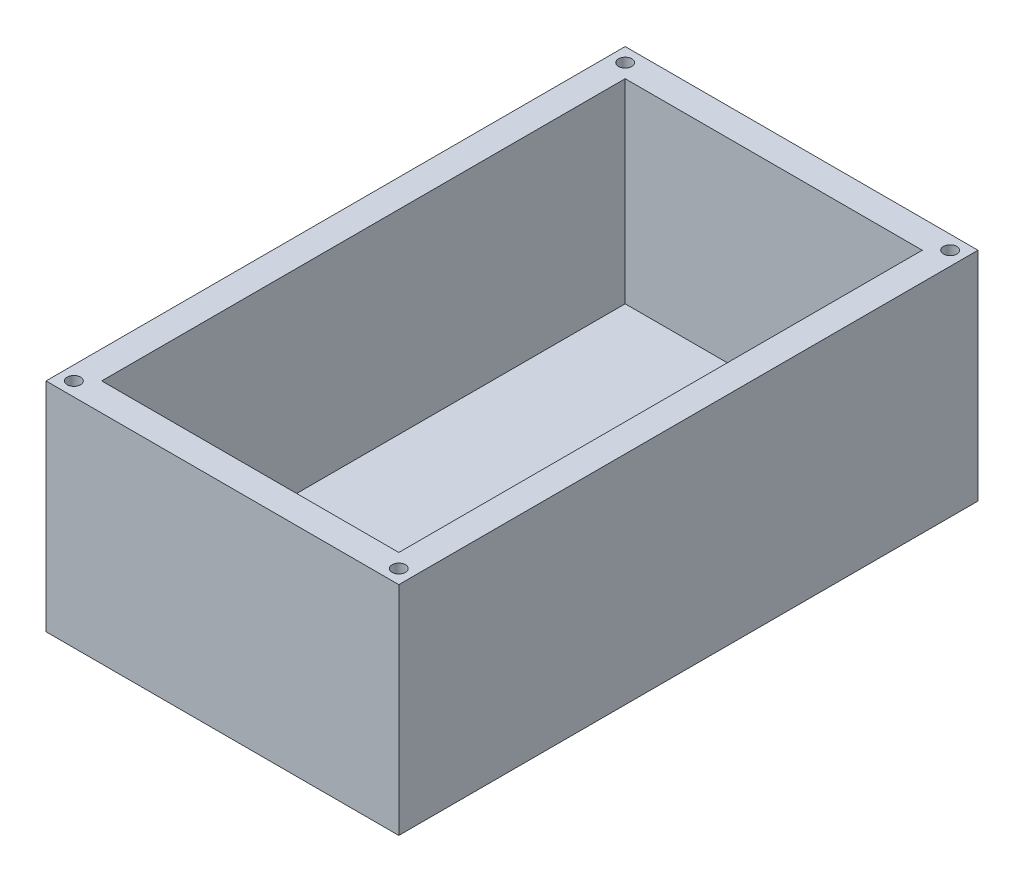
ISO-10303-21;
HEADER;
FILE_DESCRIPTION(('STEP AP214'),'2;1');
FILE_NAME('part.step','',(''),(''),'','','');
FILE_SCHEMA(('AUTOMOTIVE_DESIGN { 1 0 10303 214 1 1 1 1 }'));
ENDSEC;
DATA;
#1=APPLICATION_CONTEXT('core data for automotive mechanical design processes');
#2=APPLICATION_PROTOCOL_DEFINITION('international standard','automotive_design',2000,#1);
#3=PRODUCT_CONTEXT('',#1,'mechanical');
#4=PRODUCT('Part','Part','',(#3));
#5=PRODUCT_RELATED_PRODUCT_CATEGORY('part','',(#4));
#6=PRODUCT_DEFINITION_FORMATION('','',#4);
#7=PRODUCT_DEFINITION_CONTEXT('part definition',#1,'design');
#8=PRODUCT_DEFINITION('design','',#6,#7);
#9=PRODUCT_DEFINITION_SHAPE('','',#8);
#10=(LENGTH_UNIT() NAMED_UNIT(*) SI_UNIT(.MILLI.,.METRE.));
#11=(NAMED_UNIT(*) PLANE_ANGLE_UNIT() SI_UNIT($,.RADIAN.));
#12=(NAMED_UNIT(*) SI_UNIT($,.STERADIAN.) SOLID_ANGLE_UNIT());
#13=UNCERTAINTY_MEASURE_WITH_UNIT(LENGTH_MEASURE(1.E-05),#10,'distance_accuracy_value','');
#14=(GEOMETRIC_REPRESENTATION_CONTEXT(3) GLOBAL_UNCERTAINTY_ASSIGNED_CONTEXT((#13)) GLOBAL_UNIT_ASSIGNED_CONTEXT((#10,
#11,#12)) REPRESENTATION_CONTEXT('',''));
#15=CARTESIAN_POINT('',(0.,0.,0.));
#16=DIRECTION('',(0.,0.,1.));
#17=DIRECTION('',(1.,0.,0.));
#18=AXIS2_PLACEMENT_3D('',#15,#16,#17);
#19=CARTESIAN_POINT('',(2.49053892215568,4.,-3.42449101796407));
#20=DIRECTION('',(1.,0.,0.));
#21=DIRECTION('',(0.,0.,-1.));
#22=AXIS2_PLACEMENT_3D('',#19,#20,#21);
#23=PLANE('',#22);
#24=DIRECTION('',(0.,0.,1.));
#25=VECTOR('',#24,1.);
#26=CARTESIAN_POINT('',(2.49053892215568,0.,-3.42449101796407));
#27=LINE('',#26,#25);
#28=CARTESIAN_POINT('',(2.49053892215568,0.,-107.404491017964));
#29=VERTEX_POINT('',#28);
#30=CARTESIAN_POINT('',(2.49053892215568,0.,-3.42449101796407));
#31=VERTEX_POINT('',#30);
#32=EDGE_CURVE('E156',#29,#31,#27,.T.);
#33=ORIENTED_EDGE('',*,*,#32,.T.);
#34=DIRECTION('',(0.,-1.,0.));
#35=VECTOR('',#34,1.);
#36=CARTESIAN_POINT('',(2.49053892215568,4.,-3.42449101796407));
#37=LINE('',#36,#35);
#38=CARTESIAN_POINT('',(2.49053892215568,39.,-3.42449101796407));
#39=VERTEX_POINT('',#38);
#40=EDGE_CURVE('E11',#39,#31,#37,.T.);
#41=ORIENTED_EDGE('',*,*,#40,.F.);
#42=DIRECTION('',(0.,0.,1.));
#43=VECTOR('',#42,1.);
#44=CARTESIAN_POINT('',(2.49053892215568,39.,-107.404491017964));
#45=LINE('',#44,#43);
#46=CARTESIAN_POINT('',(2.49053892215568,39.,-107.404491017964));
#47=VERTEX_POINT('',#46);
#48=EDGE_CURVE('E119',#47,#39,#45,.T.);
#49=ORIENTED_EDGE('',*,*,#48,.F.);
#50=DIRECTION('',(0.,-1.,0.));
#51=VECTOR('',#50,1.);
#52=CARTESIAN_POINT('',(2.49053892215568,4.,-107.404491017964));
#53=LINE('',#52,#51);
#54=EDGE_CURVE('E164',#47,#29,#53,.T.);
#55=ORIENTED_EDGE('',*,*,#54,.T.);
#56=EDGE_LOOP('',(#33,#41,#49,#55));
#57=FACE_BOUND('',#56,.T.);
#58=ADVANCED_FACE('F37',(#57),#23,.F.);
#59=CARTESIAN_POINT('',(2.49053892215568,4.,-3.42449101796407));
#60=DIRECTION('',(0.,0.,-1.));
#61=DIRECTION('',(-1.,0.,0.));
#62=AXIS2_PLACEMENT_3D('',#59,#60,#61);
#63=PLANE('',#62);
#64=DIRECTION('',(1.,0.,0.));
#65=VECTOR('',#64,1.);
#66=CARTESIAN_POINT('',(2.49053892215568,0.,-3.42449101796407));
#67=LINE('',#66,#65);
#68=CARTESIAN_POINT('',(65.8305389221557,0.,-3.42449101796407));
#69=VERTEX_POINT('',#68);
#70=EDGE_CURVE('E159',#31,#69,#67,.T.);
#71=ORIENTED_EDGE('',*,*,#70,.T.);
#72=DIRECTION('',(0.,-1.,0.));
#73=VECTOR('',#72,1.);
#74=CARTESIAN_POINT('',(65.8305389221557,4.,-3.42449101796407));
#75=LINE('',#74,#73);
#76=CARTESIAN_POINT('',(65.8305389221557,39.,-3.42449101796407));
#77=VERTEX_POINT('',#76);
#78=EDGE_CURVE('E44',#77,#69,#75,.T.);
#79=ORIENTED_EDGE('',*,*,#78,.F.);
#80=DIRECTION('',(1.,0.,0.));
#81=VECTOR('',#80,1.);
#82=CARTESIAN_POINT('',(2.49053892215568,39.,-3.42449101796407));
#83=LINE('',#82,#81);
#84=EDGE_CURVE('E147',#39,#77,#83,.T.);
#85=ORIENTED_EDGE('',*,*,#84,.F.);
#86=ORIENTED_EDGE('',*,*,#40,.T.);
#87=EDGE_LOOP('',(#71,#79,#85,#86));
#88=FACE_BOUND('',#87,.T.);
#89=ADVANCED_FACE('F182',(#88),#63,.F.);
#90=CARTESIAN_POINT('',(65.8305389221557,4.,-3.42449101796407));
#91=DIRECTION('',(-1.,0.,0.));
#92=DIRECTION('',(0.,0.,1.));
#93=AXIS2_PLACEMENT_3D('',#90,#91,#92);
#94=PLANE('',#93);
#95=DIRECTION('',(0.,0.,-1.));
#96=VECTOR('',#95,1.);
#97=CARTESIAN_POINT('',(65.8305389221557,0.,-3.42449101796407));
#98=LINE('',#97,#96);
#99=CARTESIAN_POINT('',(65.8305389221557,0.,-107.404491017964));
#100=VERTEX_POINT('',#99);
#101=EDGE_CURVE('E161',#69,#100,#98,.T.);
#102=ORIENTED_EDGE('',*,*,#101,.T.);
#103=DIRECTION('',(0.,-1.,0.));
#104=VECTOR('',#103,1.);
#105=CARTESIAN_POINT('',(65.8305389221557,4.,-107.404491017964));
#106=LINE('',#105,#104);
#107=CARTESIAN_POINT('',(65.8305389221557,39.,-107.404491017964));
#108=VERTEX_POINT('',#107);
#109=EDGE_CURVE('E166',#108,#100,#106,.T.);
#110=ORIENTED_EDGE('',*,*,#109,.F.);
#111=DIRECTION('',(0.,0.,-1.));
#112=VECTOR('',#111,1.);
#113=CARTESIAN_POINT('',(65.8305389221557,39.,-107.404491017964));
#114=LINE('',#113,#112);
#115=EDGE_CURVE('E150',#77,#108,#114,.T.);
#116=ORIENTED_EDGE('',*,*,#115,.F.);
#117=ORIENTED_EDGE('',*,*,#78,.T.);
#118=EDGE_LOOP('',(#102,#110,#116,#117));
#119=FACE_BOUND('',#118,.T.);
#120=ADVANCED_FACE('F171',(#119),#94,.F.);
#121=CARTESIAN_POINT('',(2.49053892215568,4.,-107.404491017964));
#122=DIRECTION('',(0.,0.,1.));
#123=DIRECTION('',(1.,0.,0.));
#124=AXIS2_PLACEMENT_3D('',#121,#122,#123);
#125=PLANE('',#124);
#126=DIRECTION('',(-1.,0.,0.));
#127=VECTOR('',#126,1.);
#128=CARTESIAN_POINT('',(2.49053892215568,0.,-107.404491017964));
#129=LINE('',#128,#127);
#130=EDGE_CURVE('E59',#100,#29,#129,.T.);
#131=ORIENTED_EDGE('',*,*,#130,.T.);
#132=ORIENTED_EDGE('',*,*,#54,.F.);
#133=DIRECTION('',(-1.,0.,0.));
#134=VECTOR('',#133,1.);
#135=CARTESIAN_POINT('',(2.49053892215568,39.,-107.404491017964));
#136=LINE('',#135,#134);
#137=EDGE_CURVE('E153',#108,#47,#136,.T.);
#138=ORIENTED_EDGE('',*,*,#137,.F.);
#139=ORIENTED_EDGE('',*,*,#109,.T.);
#140=EDGE_LOOP('',(#131,#132,#138,#139));
#141=FACE_BOUND('',#140,.T.);
#142=ADVANCED_FACE('F180',(#141),#125,.F.);
#143=CARTESIAN_POINT('',(0.,0.,0.));
#144=DIRECTION('',(0.,-1.,0.));
#145=DIRECTION('',(0.,0.,-1.));
#146=AXIS2_PLACEMENT_3D('',#143,#144,#145);
#147=PLANE('',#146);
#148=CARTESIAN_POINT('',(4.99053892215568,0.,-104.904491017964));
#149=DIRECTION('',(0.,1.,0.));
#150=DIRECTION('',(0.,0.,1.));
#151=AXIS2_PLACEMENT_3D('',#148,#149,#150);
#152=CIRCLE('',#151,1.19999999999999);
#153=CARTESIAN_POINT('',(4.99053892215568,0.,-103.704491017964));
#154=VERTEX_POINT('',#153);
#155=EDGE_CURVE('E233',#154,#154,#152,.T.);
#156=ORIENTED_EDGE('',*,*,#155,.T.);
#157=EDGE_LOOP('',(#156));
#158=FACE_BOUND('',#157,.T.);
#159=CARTESIAN_POINT('',(63.3305389221557,0.,-104.904491017964));
#160=DIRECTION('',(0.,1.,0.));
#161=DIRECTION('',(0.,0.,1.));
#162=AXIS2_PLACEMENT_3D('',#159,#160,#161);
#163=CIRCLE('',#162,1.19999999999999);
#164=CARTESIAN_POINT('',(63.3305389221557,0.,-103.704491017964));
#165=VERTEX_POINT('',#164);
#166=EDGE_CURVE('E243',#165,#165,#163,.T.);
#167=ORIENTED_EDGE('',*,*,#166,.T.);
#168=EDGE_LOOP('',(#167));
#169=FACE_BOUND('',#168,.T.);
#170=CARTESIAN_POINT('',(63.3305389221557,0.,-5.92449101796407));
#171=DIRECTION('',(0.,1.,0.));
#172=DIRECTION('',(0.,0.,1.));
#173=AXIS2_PLACEMENT_3D('',#170,#171,#172);
#174=CIRCLE('',#173,1.19999999999999);
#175=CARTESIAN_POINT('',(63.3305389221557,0.,-4.72449101796408));
#176=VERTEX_POINT('',#175);
#177=EDGE_CURVE('E249',#176,#176,#174,.T.);
#178=ORIENTED_EDGE('',*,*,#177,.T.);
#179=EDGE_LOOP('',(#178));
#180=FACE_BOUND('',#179,.T.);
#181=CARTESIAN_POINT('',(4.99053892215568,0.,-5.92449101796407));
#182=DIRECTION('',(0.,1.,0.));
#183=DIRECTION('',(0.,0.,1.));
#184=AXIS2_PLACEMENT_3D('',#181,#182,#183);
#185=CIRCLE('',#184,1.19999999999999);
#186=CARTESIAN_POINT('',(4.99053892215568,0.,-4.72449101796408));
#187=VERTEX_POINT('',#186);
#188=EDGE_CURVE('E134',#187,#187,#185,.T.);
#189=ORIENTED_EDGE('',*,*,#188,.T.);
#190=EDGE_LOOP('',(#189));
#191=FACE_BOUND('',#190,.T.);
#192=ORIENTED_EDGE('',*,*,#32,.F.);
#193=ORIENTED_EDGE('',*,*,#130,.F.);
#194=ORIENTED_EDGE('',*,*,#101,.F.);
#195=ORIENTED_EDGE('',*,*,#70,.F.);
#196=EDGE_LOOP('',(#192,#193,#194,#195));
#197=FACE_BOUND('',#196,.T.);
#198=ADVANCED_FACE('F176',(#158,#169,#180,#191,#197),#147,.T.);
#199=CARTESIAN_POINT('',(0.,39.,0.));
#200=DIRECTION('',(0.,1.,0.));
#201=DIRECTION('',(0.,0.,1.));
#202=AXIS2_PLACEMENT_3D('',#199,#200,#201);
#203=PLANE('',#202);
#204=CARTESIAN_POINT('',(4.99053892215568,39.,-104.904491017964));
#205=DIRECTION('',(0.,1.,0.));
#206=DIRECTION('',(0.,0.,1.));
#207=AXIS2_PLACEMENT_3D('',#204,#205,#206);
#208=CIRCLE('',#207,1.19999999999999);
#209=CARTESIAN_POINT('',(4.99053892215568,39.,-103.704491017964));
#210=VERTEX_POINT('',#209);
#211=EDGE_CURVE('E236',#210,#210,#208,.T.);
#212=ORIENTED_EDGE('',*,*,#211,.F.);
#213=EDGE_LOOP('',(#212));
#214=FACE_BOUND('',#213,.T.);
#215=CARTESIAN_POINT('',(63.3305389221557,39.,-104.904491017964));
#216=DIRECTION('',(0.,1.,0.));
#217=DIRECTION('',(0.,0.,1.));
#218=AXIS2_PLACEMENT_3D('',#215,#216,#217);
#219=CIRCLE('',#218,1.19999999999999);
#220=CARTESIAN_POINT('',(63.3305389221557,39.,-103.704491017964));
#221=VERTEX_POINT('',#220);
#222=EDGE_CURVE('E238',#221,#221,#219,.T.);
#223=ORIENTED_EDGE('',*,*,#222,.F.);
#224=EDGE_LOOP('',(#223));
#225=FACE_BOUND('',#224,.T.);
#226=CARTESIAN_POINT('',(63.3305389221557,39.,-5.92449101796407));
#227=DIRECTION('',(0.,1.,0.));
#228=DIRECTION('',(0.,0.,1.));
#229=AXIS2_PLACEMENT_3D('',#226,#227,#228);
#230=CIRCLE('',#229,1.19999999999999);
#231=CARTESIAN_POINT('',(63.3305389221557,39.,-4.72449101796408));
#232=VERTEX_POINT('',#231);
#233=EDGE_CURVE('E246',#232,#232,#230,.T.);
#234=ORIENTED_EDGE('',*,*,#233,.F.);
#235=EDGE_LOOP('',(#234));
#236=FACE_BOUND('',#235,.T.);
#237=CARTESIAN_POINT('',(4.99053892215568,39.,-5.92449101796407));
#238=DIRECTION('',(0.,1.,0.));
#239=DIRECTION('',(0.,0.,1.));
#240=AXIS2_PLACEMENT_3D('',#237,#238,#239);
#241=CIRCLE('',#240,1.19999999999999);
#242=CARTESIAN_POINT('',(4.99053892215568,39.,-4.72449101796408));
#243=VERTEX_POINT('',#242);
#244=EDGE_CURVE('E252',#243,#243,#241,.T.);
#245=ORIENTED_EDGE('',*,*,#244,.F.);
#246=EDGE_LOOP('',(#245));
#247=FACE_BOUND('',#246,.T.);
#248=ORIENTED_EDGE('',*,*,#48,.T.);
#249=ORIENTED_EDGE('',*,*,#84,.T.);
#250=ORIENTED_EDGE('',*,*,#115,.T.);
#251=ORIENTED_EDGE('',*,*,#137,.T.);
#252=EDGE_LOOP('',(#248,#249,#250,#251));
#253=FACE_BOUND('',#252,.T.);
#254=DIRECTION('',(0.,0.,1.));
#255=VECTOR('',#254,1.);
#256=CARTESIAN_POINT('',(7.49053892215568,39.,-102.404491017964));
#257=LINE('',#256,#255);
#258=CARTESIAN_POINT('',(7.49053892215568,39.,-102.404491017964));
#259=VERTEX_POINT('',#258);
#260=CARTESIAN_POINT('',(7.49053892215568,39.,-8.42449101796407));
#261=VERTEX_POINT('',#260);
#262=EDGE_CURVE('E111',#259,#261,#257,.T.);
#263=ORIENTED_EDGE('',*,*,#262,.F.);
#264=DIRECTION('',(-1.,0.,0.));
#265=VECTOR('',#264,1.);
#266=CARTESIAN_POINT('',(7.49053892215568,39.,-102.404491017964));
#267=LINE('',#266,#265);
#268=CARTESIAN_POINT('',(60.8305389221557,39.,-102.404491017964));
#269=VERTEX_POINT('',#268);
#270=EDGE_CURVE('E103',#269,#259,#267,.T.);
#271=ORIENTED_EDGE('',*,*,#270,.F.);
#272=DIRECTION('',(0.,0.,-1.));
#273=VECTOR('',#272,1.);
#274=CARTESIAN_POINT('',(60.8305389221557,39.,-102.404491017964));
#275=LINE('',#274,#273);
#276=CARTESIAN_POINT('',(60.8305389221557,39.,-8.42449101796407));
#277=VERTEX_POINT('',#276);
#278=EDGE_CURVE('E127',#277,#269,#275,.T.);
#279=ORIENTED_EDGE('',*,*,#278,.F.);
#280=DIRECTION('',(1.,0.,0.));
#281=VECTOR('',#280,1.);
#282=CARTESIAN_POINT('',(7.49053892215568,39.,-8.42449101796407));
#283=LINE('',#282,#281);
#284=EDGE_CURVE('E125',#261,#277,#283,.T.);
#285=ORIENTED_EDGE('',*,*,#284,.F.);
#286=EDGE_LOOP('',(#263,#271,#279,#285));
#287=FACE_BOUND('',#286,.T.);
#288=ADVANCED_FACE('F123',(#214,#225,#236,#247,#253,#287),#203,.T.);
#289=CARTESIAN_POINT('',(7.49053892215568,39.,-102.404491017964));
#290=DIRECTION('',(0.,0.,1.));
#291=DIRECTION('',(1.,0.,0.));
#292=AXIS2_PLACEMENT_3D('',#289,#290,#291);
#293=PLANE('',#292);
#294=DIRECTION('',(-1.,0.,0.));
#295=VECTOR('',#294,1.);
#296=CARTESIAN_POINT('',(7.49053892215568,4.,-102.404491017964));
#297=LINE('',#296,#295);
#298=CARTESIAN_POINT('',(60.8305389221557,4.,-102.404491017964));
#299=VERTEX_POINT('',#298);
#300=CARTESIAN_POINT('',(7.49053892215568,4.,-102.404491017964));
#301=VERTEX_POINT('',#300);
#302=EDGE_CURVE('E132',#299,#301,#297,.T.);
#303=ORIENTED_EDGE('',*,*,#302,.F.);
#304=DIRECTION('',(0.,-1.,0.));
#305=VECTOR('',#304,1.);
#306=CARTESIAN_POINT('',(60.8305389221557,39.,-102.404491017964));
#307=LINE('',#306,#305);
#308=EDGE_CURVE('E51',#269,#299,#307,.T.);
#309=ORIENTED_EDGE('',*,*,#308,.F.);
#310=ORIENTED_EDGE('',*,*,#270,.T.);
#311=DIRECTION('',(0.,-1.,0.));
#312=VECTOR('',#311,1.);
#313=CARTESIAN_POINT('',(7.49053892215568,39.,-102.404491017964));
#314=LINE('',#313,#312);
#315=EDGE_CURVE('E106',#259,#301,#314,.T.);
#316=ORIENTED_EDGE('',*,*,#315,.T.);
#317=EDGE_LOOP('',(#303,#309,#310,#316));
#318=FACE_BOUND('',#317,.T.);
#319=ADVANCED_FACE('F105',(#318),#293,.T.);
#320=CARTESIAN_POINT('',(7.49053892215568,39.,-102.404491017964));
#321=DIRECTION('',(1.,0.,0.));
#322=DIRECTION('',(0.,0.,-1.));
#323=AXIS2_PLACEMENT_3D('',#320,#321,#322);
#324=PLANE('',#323);
#325=DIRECTION('',(0.,0.,1.));
#326=VECTOR('',#325,1.);
#327=CARTESIAN_POINT('',(7.49053892215568,4.,-102.404491017964));
#328=LINE('',#327,#326);
#329=CARTESIAN_POINT('',(7.49053892215568,4.,-8.42449101796407));
#330=VERTEX_POINT('',#329);
#331=EDGE_CURVE('E118',#301,#330,#328,.T.);
#332=ORIENTED_EDGE('',*,*,#331,.F.);
#333=ORIENTED_EDGE('',*,*,#315,.F.);
#334=ORIENTED_EDGE('',*,*,#262,.T.);
#335=DIRECTION('',(0.,-1.,0.));
#336=VECTOR('',#335,1.);
#337=CARTESIAN_POINT('',(7.49053892215568,39.,-8.42449101796407));
#338=LINE('',#337,#336);
#339=EDGE_CURVE('E120',#261,#330,#338,.T.);
#340=ORIENTED_EDGE('',*,*,#339,.T.);
#341=EDGE_LOOP('',(#332,#333,#334,#340));
#342=FACE_BOUND('',#341,.T.);
#343=ADVANCED_FACE('F115',(#342),#324,.T.);
#344=CARTESIAN_POINT('',(7.49053892215568,39.,-8.42449101796407));
#345=DIRECTION('',(0.,0.,-1.));
#346=DIRECTION('',(-1.,0.,0.));
#347=AXIS2_PLACEMENT_3D('',#344,#345,#346);
#348=PLANE('',#347);
#349=DIRECTION('',(1.,0.,0.));
#350=VECTOR('',#349,1.);
#351=CARTESIAN_POINT('',(7.49053892215568,4.,-8.42449101796407));
#352=LINE('',#351,#350);
#353=CARTESIAN_POINT('',(60.8305389221557,4.,-8.42449101796407));
#354=VERTEX_POINT('',#353);
#355=EDGE_CURVE('E136',#330,#354,#352,.T.);
#356=ORIENTED_EDGE('',*,*,#355,.F.);
#357=ORIENTED_EDGE('',*,*,#339,.F.);
#358=ORIENTED_EDGE('',*,*,#284,.T.);
#359=DIRECTION('',(0.,-1.,0.));
#360=VECTOR('',#359,1.);
#361=CARTESIAN_POINT('',(60.8305389221557,39.,-8.42449101796407));
#362=LINE('',#361,#360);
#363=EDGE_CURVE('E142',#277,#354,#362,.T.);
#364=ORIENTED_EDGE('',*,*,#363,.T.);
#365=EDGE_LOOP('',(#356,#357,#358,#364));
#366=FACE_BOUND('',#365,.T.);
#367=ADVANCED_FACE('F208',(#366),#348,.T.);
#368=CARTESIAN_POINT('',(60.8305389221557,39.,-102.404491017964));
#369=DIRECTION('',(-1.,0.,0.));
#370=DIRECTION('',(0.,0.,1.));
#371=AXIS2_PLACEMENT_3D('',#368,#369,#370);
#372=PLANE('',#371);
#373=DIRECTION('',(0.,0.,-1.));
#374=VECTOR('',#373,1.);
#375=CARTESIAN_POINT('',(60.8305389221557,4.,-102.404491017964));
#376=LINE('',#375,#374);
#377=EDGE_CURVE('E112',#354,#299,#376,.T.);
#378=ORIENTED_EDGE('',*,*,#377,.F.);
#379=ORIENTED_EDGE('',*,*,#363,.F.);
#380=ORIENTED_EDGE('',*,*,#278,.T.);
#381=ORIENTED_EDGE('',*,*,#308,.T.);
#382=EDGE_LOOP('',(#378,#379,#380,#381));
#383=FACE_BOUND('',#382,.T.);
#384=ADVANCED_FACE('F199',(#383),#372,.T.);
#385=CARTESIAN_POINT('',(0.,4.,0.));
#386=DIRECTION('',(0.,-1.,0.));
#387=DIRECTION('',(0.,0.,-1.));
#388=AXIS2_PLACEMENT_3D('',#385,#386,#387);
#389=PLANE('',#388);
#390=ORIENTED_EDGE('',*,*,#377,.T.);
#391=ORIENTED_EDGE('',*,*,#302,.T.);
#392=ORIENTED_EDGE('',*,*,#331,.T.);
#393=ORIENTED_EDGE('',*,*,#355,.T.);
#394=EDGE_LOOP('',(#390,#391,#392,#393));
#395=FACE_BOUND('',#394,.T.);
#396=ADVANCED_FACE('F195',(#395),#389,.F.);
#397=CARTESIAN_POINT('',(4.99053892215568,39.,-5.92449101796407));
#398=DIRECTION('',(0.,1.,0.));
#399=DIRECTION('',(0.,0.,1.));
#400=AXIS2_PLACEMENT_3D('',#397,#398,#399);
#401=CYLINDRICAL_SURFACE('',#400,1.19999999999999);
#402=ORIENTED_EDGE('',*,*,#188,.F.);
#403=EDGE_LOOP('',(#402));
#404=FACE_BOUND('',#403,.T.);
#405=ORIENTED_EDGE('',*,*,#244,.T.);
#406=EDGE_LOOP('',(#405));
#407=FACE_BOUND('',#406,.T.);
#408=ADVANCED_FACE('F198',(#404,#407),#401,.F.);
#409=CARTESIAN_POINT('',(63.3305389221557,39.,-5.92449101796407));
#410=DIRECTION('',(0.,1.,0.));
#411=DIRECTION('',(0.,0.,1.));
#412=AXIS2_PLACEMENT_3D('',#409,#410,#411);
#413=CYLINDRICAL_SURFACE('',#412,1.19999999999999);
#414=ORIENTED_EDGE('',*,*,#177,.F.);
#415=EDGE_LOOP('',(#414));
#416=FACE_BOUND('',#415,.T.);
#417=ORIENTED_EDGE('',*,*,#233,.T.);
#418=EDGE_LOOP('',(#417));
#419=FACE_BOUND('',#418,.T.);
#420=ADVANCED_FACE('F216',(#416,#419),#413,.F.);
#421=CARTESIAN_POINT('',(63.3305389221557,39.,-104.904491017964));
#422=DIRECTION('',(0.,1.,0.));
#423=DIRECTION('',(0.,0.,1.));
#424=AXIS2_PLACEMENT_3D('',#421,#422,#423);
#425=CYLINDRICAL_SURFACE('',#424,1.19999999999999);
#426=ORIENTED_EDGE('',*,*,#166,.F.);
#427=EDGE_LOOP('',(#426));
#428=FACE_BOUND('',#427,.T.);
#429=ORIENTED_EDGE('',*,*,#222,.T.);
#430=EDGE_LOOP('',(#429));
#431=FACE_BOUND('',#430,.T.);
#432=ADVANCED_FACE('F220',(#428,#431),#425,.F.);
#433=CARTESIAN_POINT('',(4.99053892215568,39.,-104.904491017964));
#434=DIRECTION('',(0.,1.,0.));
#435=DIRECTION('',(0.,0.,1.));
#436=AXIS2_PLACEMENT_3D('',#433,#434,#435);
#437=CYLINDRICAL_SURFACE('',#436,1.19999999999999);
#438=ORIENTED_EDGE('',*,*,#155,.F.);
#439=EDGE_LOOP('',(#438));
#440=FACE_BOUND('',#439,.T.);
#441=ORIENTED_EDGE('',*,*,#211,.T.);
#442=EDGE_LOOP('',(#441));
#443=FACE_BOUND('',#442,.T.);
#444=ADVANCED_FACE('F224',(#440,#443),#437,.F.);
#445=CLOSED_SHELL('',(#58,#89,#120,#142,#198,#288,#319,#343,#367,#384,#396,#408,#420,#432,#444));
#446=MANIFOLD_SOLID_BREP('B2',#445);
#447=ADVANCED_BREP_SHAPE_REPRESENTATION('',(#18,#446),#14);
#448=SHAPE_DEFINITION_REPRESENTATION(#9,#447);
ENDSEC;
END-ISO-10303-21;
